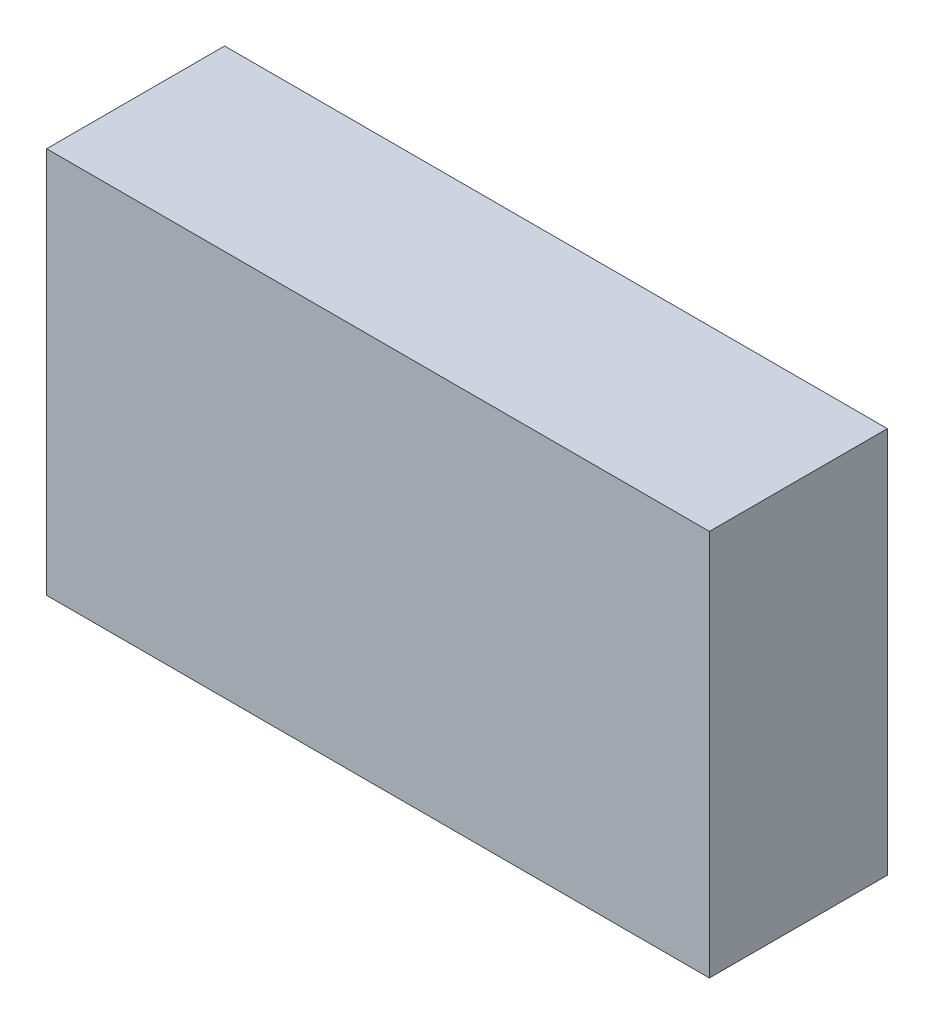
ISO-10303-21;
HEADER;
FILE_DESCRIPTION(('STEP AP214'),'2;1');
FILE_NAME('part.step','',(''),(''),'','','');
FILE_SCHEMA(('AUTOMOTIVE_DESIGN { 1 0 10303 214 1 1 1 1 }'));
ENDSEC;
DATA;
#1=APPLICATION_CONTEXT('core data for automotive mechanical design processes');
#2=APPLICATION_PROTOCOL_DEFINITION('international standard','automotive_design',2000,#1);
#3=PRODUCT_CONTEXT('',#1,'mechanical');
#4=PRODUCT('Part','Part','',(#3));
#5=PRODUCT_RELATED_PRODUCT_CATEGORY('part','',(#4));
#6=PRODUCT_DEFINITION_FORMATION('','',#4);
#7=PRODUCT_DEFINITION_CONTEXT('part definition',#1,'design');
#8=PRODUCT_DEFINITION('design','',#6,#7);
#9=PRODUCT_DEFINITION_SHAPE('','',#8);
#10=(LENGTH_UNIT() NAMED_UNIT(*) SI_UNIT(.MILLI.,.METRE.));
#11=(NAMED_UNIT(*) PLANE_ANGLE_UNIT() SI_UNIT($,.RADIAN.));
#12=(NAMED_UNIT(*) SI_UNIT($,.STERADIAN.) SOLID_ANGLE_UNIT());
#13=UNCERTAINTY_MEASURE_WITH_UNIT(LENGTH_MEASURE(1.E-05),#10,'distance_accuracy_value','');
#14=(GEOMETRIC_REPRESENTATION_CONTEXT(3) GLOBAL_UNCERTAINTY_ASSIGNED_CONTEXT((#13)) GLOBAL_UNIT_ASSIGNED_CONTEXT((#10,
#11,#12)) REPRESENTATION_CONTEXT('',''));
#15=CARTESIAN_POINT('',(0.,0.,0.));
#16=DIRECTION('',(0.,0.,1.));
#17=DIRECTION('',(1.,0.,0.));
#18=AXIS2_PLACEMENT_3D('',#15,#16,#17);
#19=CARTESIAN_POINT('',(-18.25,-10.65,9.8));
#20=DIRECTION('',(0.,0.,1.));
#21=DIRECTION('',(1.,0.,0.));
#22=AXIS2_PLACEMENT_3D('',#19,#20,#21);
#23=PLANE('',#22);
#24=DIRECTION('',(0.,1.,0.));
#25=VECTOR('',#24,1.);
#26=CARTESIAN_POINT('',(-18.25,-10.65,9.8));
#27=LINE('',#26,#25);
#28=CARTESIAN_POINT('',(-18.25,-10.65,9.8));
#29=VERTEX_POINT('',#28);
#30=CARTESIAN_POINT('',(-18.25,10.65,9.8));
#31=VERTEX_POINT('',#30);
#32=EDGE_CURVE('E87',#29,#31,#27,.T.);
#33=ORIENTED_EDGE('',*,*,#32,.F.);
#34=DIRECTION('',(1.,0.,0.));
#35=VECTOR('',#34,1.);
#36=CARTESIAN_POINT('',(-18.25,-10.65,9.8));
#37=LINE('',#36,#35);
#38=CARTESIAN_POINT('',(18.25,-10.65,9.8));
#39=VERTEX_POINT('',#38);
#40=EDGE_CURVE('E70',#29,#39,#37,.T.);
#41=ORIENTED_EDGE('',*,*,#40,.T.);
#42=DIRECTION('',(0.,1.,0.));
#43=VECTOR('',#42,1.);
#44=CARTESIAN_POINT('',(18.25,-10.65,9.8));
#45=LINE('',#44,#43);
#46=CARTESIAN_POINT('',(18.25,10.65,9.8));
#47=VERTEX_POINT('',#46);
#48=EDGE_CURVE('E82',#39,#47,#45,.T.);
#49=ORIENTED_EDGE('',*,*,#48,.T.);
#50=DIRECTION('',(1.,0.,0.));
#51=VECTOR('',#50,1.);
#52=CARTESIAN_POINT('',(-18.25,10.65,9.8));
#53=LINE('',#52,#51);
#54=EDGE_CURVE('E10',#31,#47,#53,.T.);
#55=ORIENTED_EDGE('',*,*,#54,.F.);
#56=EDGE_LOOP('',(#33,#41,#49,#55));
#57=FACE_BOUND('',#56,.T.);
#58=ADVANCED_FACE('F16',(#57),#23,.T.);
#59=CARTESIAN_POINT('',(-18.25,-10.65,0.));
#60=DIRECTION('',(0.,0.,1.));
#61=DIRECTION('',(1.,0.,0.));
#62=AXIS2_PLACEMENT_3D('',#59,#60,#61);
#63=PLANE('',#62);
#64=DIRECTION('',(1.,0.,0.));
#65=VECTOR('',#64,1.);
#66=CARTESIAN_POINT('',(-18.25,10.65,0.));
#67=LINE('',#66,#65);
#68=CARTESIAN_POINT('',(-18.25,10.65,0.));
#69=VERTEX_POINT('',#68);
#70=CARTESIAN_POINT('',(18.25,10.65,0.));
#71=VERTEX_POINT('',#70);
#72=EDGE_CURVE('E19',#69,#71,#67,.T.);
#73=ORIENTED_EDGE('',*,*,#72,.T.);
#74=DIRECTION('',(0.,1.,0.));
#75=VECTOR('',#74,1.);
#76=CARTESIAN_POINT('',(18.25,-10.65,0.));
#77=LINE('',#76,#75);
#78=CARTESIAN_POINT('',(18.25,-10.65,0.));
#79=VERTEX_POINT('',#78);
#80=EDGE_CURVE('E104',#79,#71,#77,.T.);
#81=ORIENTED_EDGE('',*,*,#80,.F.);
#82=DIRECTION('',(1.,0.,0.));
#83=VECTOR('',#82,1.);
#84=CARTESIAN_POINT('',(-18.25,-10.65,0.));
#85=LINE('',#84,#83);
#86=CARTESIAN_POINT('',(-18.25,-10.65,0.));
#87=VERTEX_POINT('',#86);
#88=EDGE_CURVE('E81',#87,#79,#85,.T.);
#89=ORIENTED_EDGE('',*,*,#88,.F.);
#90=DIRECTION('',(0.,1.,0.));
#91=VECTOR('',#90,1.);
#92=CARTESIAN_POINT('',(-18.25,-10.65,0.));
#93=LINE('',#92,#91);
#94=EDGE_CURVE('E88',#87,#69,#93,.T.);
#95=ORIENTED_EDGE('',*,*,#94,.T.);
#96=EDGE_LOOP('',(#73,#81,#89,#95));
#97=FACE_BOUND('',#96,.T.);
#98=ADVANCED_FACE('F118',(#97),#63,.F.);
#99=CARTESIAN_POINT('',(-18.25,10.65,0.));
#100=DIRECTION('',(0.,1.,0.));
#101=DIRECTION('',(1.,0.,0.));
#102=AXIS2_PLACEMENT_3D('',#99,#100,#101);
#103=PLANE('',#102);
#104=ORIENTED_EDGE('',*,*,#72,.F.);
#105=DIRECTION('',(0.,0.,1.));
#106=VECTOR('',#105,1.);
#107=CARTESIAN_POINT('',(-18.25,10.65,0.));
#108=LINE('',#107,#106);
#109=EDGE_CURVE('E92',#69,#31,#108,.T.);
#110=ORIENTED_EDGE('',*,*,#109,.T.);
#111=ORIENTED_EDGE('',*,*,#54,.T.);
#112=DIRECTION('',(0.,0.,1.));
#113=VECTOR('',#112,1.);
#114=CARTESIAN_POINT('',(18.25,10.65,0.));
#115=LINE('',#114,#113);
#116=EDGE_CURVE('E108',#71,#47,#115,.T.);
#117=ORIENTED_EDGE('',*,*,#116,.F.);
#118=EDGE_LOOP('',(#104,#110,#111,#117));
#119=FACE_BOUND('',#118,.T.);
#120=ADVANCED_FACE('F116',(#119),#103,.T.);
#121=CARTESIAN_POINT('',(-18.25,-10.65,0.));
#122=DIRECTION('',(0.,1.,0.));
#123=DIRECTION('',(1.,0.,0.));
#124=AXIS2_PLACEMENT_3D('',#121,#122,#123);
#125=PLANE('',#124);
#126=DIRECTION('',(0.,0.,1.));
#127=VECTOR('',#126,1.);
#128=CARTESIAN_POINT('',(18.25,-10.65,0.));
#129=LINE('',#128,#127);
#130=EDGE_CURVE('E76',#79,#39,#129,.T.);
#131=ORIENTED_EDGE('',*,*,#130,.T.);
#132=ORIENTED_EDGE('',*,*,#40,.F.);
#133=DIRECTION('',(0.,0.,1.));
#134=VECTOR('',#133,1.);
#135=CARTESIAN_POINT('',(-18.25,-10.65,0.));
#136=LINE('',#135,#134);
#137=EDGE_CURVE('E73',#87,#29,#136,.T.);
#138=ORIENTED_EDGE('',*,*,#137,.F.);
#139=ORIENTED_EDGE('',*,*,#88,.T.);
#140=EDGE_LOOP('',(#131,#132,#138,#139));
#141=FACE_BOUND('',#140,.T.);
#142=ADVANCED_FACE('F72',(#141),#125,.F.);
#143=CARTESIAN_POINT('',(18.25,-10.65,0.));
#144=DIRECTION('',(1.,0.,0.));
#145=DIRECTION('',(0.,1.,0.));
#146=AXIS2_PLACEMENT_3D('',#143,#144,#145);
#147=PLANE('',#146);
#148=ORIENTED_EDGE('',*,*,#130,.F.);
#149=ORIENTED_EDGE('',*,*,#80,.T.);
#150=ORIENTED_EDGE('',*,*,#116,.T.);
#151=ORIENTED_EDGE('',*,*,#48,.F.);
#152=EDGE_LOOP('',(#148,#149,#150,#151));
#153=FACE_BOUND('',#152,.T.);
#154=ADVANCED_FACE('F115',(#153),#147,.T.);
#155=CARTESIAN_POINT('',(-18.25,-10.65,0.));
#156=DIRECTION('',(1.,0.,0.));
#157=DIRECTION('',(0.,1.,0.));
#158=AXIS2_PLACEMENT_3D('',#155,#156,#157);
#159=PLANE('',#158);
#160=ORIENTED_EDGE('',*,*,#32,.T.);
#161=ORIENTED_EDGE('',*,*,#109,.F.);
#162=ORIENTED_EDGE('',*,*,#94,.F.);
#163=ORIENTED_EDGE('',*,*,#137,.T.);
#164=EDGE_LOOP('',(#160,#161,#162,#163));
#165=FACE_BOUND('',#164,.T.);
#166=ADVANCED_FACE('F85',(#165),#159,.F.);
#167=CLOSED_SHELL('',(#58,#98,#120,#142,#154,#166));
#168=MANIFOLD_SOLID_BREP('B1',#167);
#169=ADVANCED_BREP_SHAPE_REPRESENTATION('',(#18,#168),#14);
#170=SHAPE_DEFINITION_REPRESENTATION(#9,#169);
ENDSEC;
END-ISO-10303-21;
